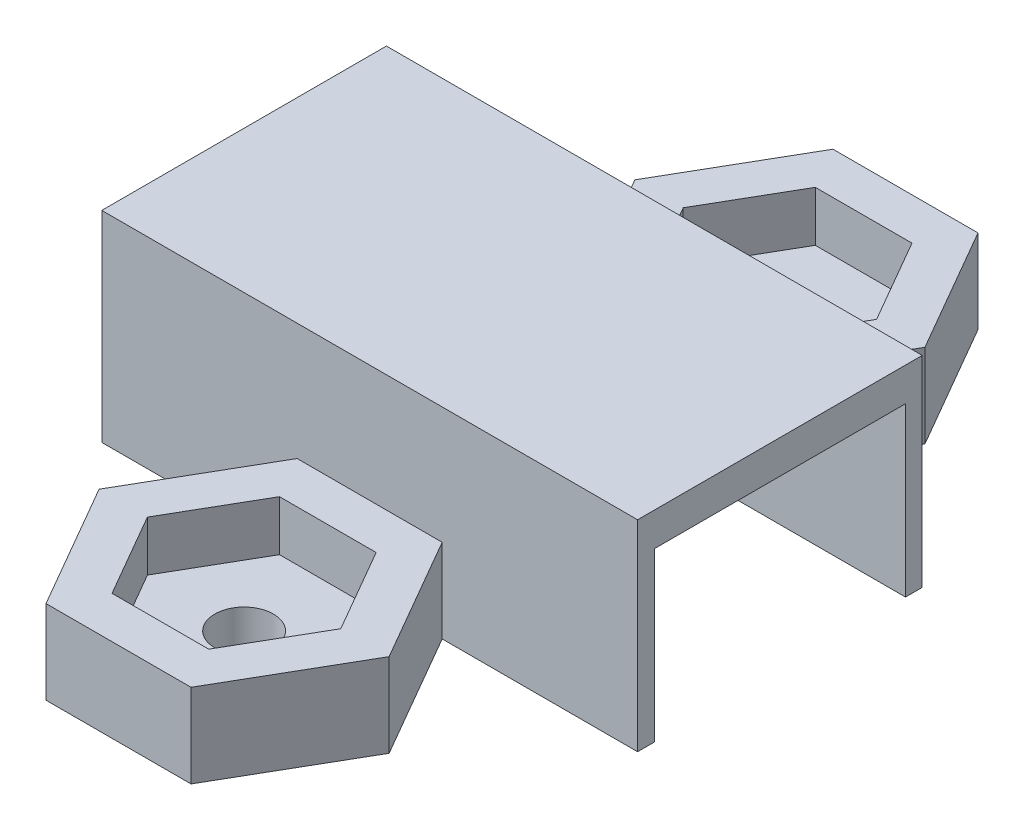
ISO-10303-21;
HEADER;
FILE_DESCRIPTION(('STEP AP214'),'2;1');
FILE_NAME('part.step','',(''),(''),'','','');
FILE_SCHEMA(('AUTOMOTIVE_DESIGN { 1 0 10303 214 1 1 1 1 }'));
ENDSEC;
DATA;
#1=APPLICATION_CONTEXT('core data for automotive mechanical design processes');
#2=APPLICATION_PROTOCOL_DEFINITION('international standard','automotive_design',2000,#1);
#3=PRODUCT_CONTEXT('',#1,'mechanical');
#4=PRODUCT('Part','Part','',(#3));
#5=PRODUCT_RELATED_PRODUCT_CATEGORY('part','',(#4));
#6=PRODUCT_DEFINITION_FORMATION('','',#4);
#7=PRODUCT_DEFINITION_CONTEXT('part definition',#1,'design');
#8=PRODUCT_DEFINITION('design','',#6,#7);
#9=PRODUCT_DEFINITION_SHAPE('','',#8);
#10=(LENGTH_UNIT() NAMED_UNIT(*) SI_UNIT(.MILLI.,.METRE.));
#11=(NAMED_UNIT(*) PLANE_ANGLE_UNIT() SI_UNIT($,.RADIAN.));
#12=(NAMED_UNIT(*) SI_UNIT($,.STERADIAN.) SOLID_ANGLE_UNIT());
#13=UNCERTAINTY_MEASURE_WITH_UNIT(LENGTH_MEASURE(1.E-05),#10,'distance_accuracy_value','');
#14=(GEOMETRIC_REPRESENTATION_CONTEXT(3) GLOBAL_UNCERTAINTY_ASSIGNED_CONTEXT((#13)) GLOBAL_UNIT_ASSIGNED_CONTEXT((#10,
#11,#12)) REPRESENTATION_CONTEXT('',''));
#15=CARTESIAN_POINT('',(0.,0.,0.));
#16=DIRECTION('',(0.,0.,1.));
#17=DIRECTION('',(1.,0.,0.));
#18=AXIS2_PLACEMENT_3D('',#15,#16,#17);
#19=CARTESIAN_POINT('',(-16.,12.,8.5));
#20=DIRECTION('',(0.,0.,-1.));
#21=DIRECTION('',(-1.,0.,0.));
#22=AXIS2_PLACEMENT_3D('',#19,#20,#21);
#23=PLANE('',#22);
#24=DIRECTION('',(0.,-1.,0.));
#25=VECTOR('',#24,1.);
#26=CARTESIAN_POINT('',(-4.3301270189222,5.,8.5));
#27=LINE('',#26,#25);
#28=CARTESIAN_POINT('',(-4.3301270189222,5.,8.5));
#29=VERTEX_POINT('',#28);
#30=CARTESIAN_POINT('',(-4.3301270189222,0.,8.5));
#31=VERTEX_POINT('',#30);
#32=EDGE_CURVE('E443',#29,#31,#27,.T.);
#33=ORIENTED_EDGE('',*,*,#32,.F.);
#34=DIRECTION('',(1.,0.,0.));
#35=VECTOR('',#34,1.);
#36=CARTESIAN_POINT('',(4.33012701892219,5.,8.5));
#37=LINE('',#36,#35);
#38=CARTESIAN_POINT('',(4.33012701892219,5.,8.5));
#39=VERTEX_POINT('',#38);
#40=EDGE_CURVE('E408',#29,#39,#37,.T.);
#41=ORIENTED_EDGE('',*,*,#40,.T.);
#42=DIRECTION('',(0.,-1.,0.));
#43=VECTOR('',#42,1.);
#44=CARTESIAN_POINT('',(4.33012701892219,5.,8.5));
#45=LINE('',#44,#43);
#46=CARTESIAN_POINT('',(4.33012701892219,0.,8.5));
#47=VERTEX_POINT('',#46);
#48=EDGE_CURVE('E439',#39,#47,#45,.T.);
#49=ORIENTED_EDGE('',*,*,#48,.T.);
#50=DIRECTION('',(1.,0.,0.));
#51=VECTOR('',#50,1.);
#52=CARTESIAN_POINT('',(-16.,0.,8.5));
#53=LINE('',#52,#51);
#54=CARTESIAN_POINT('',(16.,0.,8.5));
#55=VERTEX_POINT('',#54);
#56=EDGE_CURVE('E561',#47,#55,#53,.T.);
#57=ORIENTED_EDGE('',*,*,#56,.T.);
#58=DIRECTION('',(0.,-1.,0.));
#59=VECTOR('',#58,1.);
#60=CARTESIAN_POINT('',(16.,12.,8.5));
#61=LINE('',#60,#59);
#62=CARTESIAN_POINT('',(16.,12.,8.5));
#63=VERTEX_POINT('',#62);
#64=EDGE_CURVE('E582',#63,#55,#61,.T.);
#65=ORIENTED_EDGE('',*,*,#64,.F.);
#66=DIRECTION('',(1.,0.,0.));
#67=VECTOR('',#66,1.);
#68=CARTESIAN_POINT('',(-16.,12.,8.5));
#69=LINE('',#68,#67);
#70=CARTESIAN_POINT('',(-16.,12.,8.5));
#71=VERTEX_POINT('',#70);
#72=EDGE_CURVE('E546',#71,#63,#69,.T.);
#73=ORIENTED_EDGE('',*,*,#72,.F.);
#74=DIRECTION('',(0.,-1.,0.));
#75=VECTOR('',#74,1.);
#76=CARTESIAN_POINT('',(-16.,12.,8.5));
#77=LINE('',#76,#75);
#78=CARTESIAN_POINT('',(-16.,0.,8.5));
#79=VERTEX_POINT('',#78);
#80=EDGE_CURVE('E586',#71,#79,#77,.T.);
#81=ORIENTED_EDGE('',*,*,#80,.T.);
#82=EDGE_CURVE('E562',#79,#31,#53,.T.);
#83=ORIENTED_EDGE('',*,*,#82,.T.);
#84=EDGE_LOOP('',(#33,#41,#49,#57,#65,#73,#81,#83));
#85=FACE_BOUND('',#84,.T.);
#86=ADVANCED_FACE('F39',(#85),#23,.F.);
#87=CARTESIAN_POINT('',(-16.,12.,-8.5));
#88=DIRECTION('',(0.,0.,1.));
#89=DIRECTION('',(1.,0.,0.));
#90=AXIS2_PLACEMENT_3D('',#87,#88,#89);
#91=PLANE('',#90);
#92=DIRECTION('',(0.,-1.,0.));
#93=VECTOR('',#92,1.);
#94=CARTESIAN_POINT('',(4.33012701892219,5.,-8.5));
#95=LINE('',#94,#93);
#96=CARTESIAN_POINT('',(4.33012701892219,5.,-8.5));
#97=VERTEX_POINT('',#96);
#98=CARTESIAN_POINT('',(4.33012701892219,0.,-8.5));
#99=VERTEX_POINT('',#98);
#100=EDGE_CURVE('E479',#97,#99,#95,.T.);
#101=ORIENTED_EDGE('',*,*,#100,.F.);
#102=DIRECTION('',(-1.,0.,0.));
#103=VECTOR('',#102,1.);
#104=CARTESIAN_POINT('',(4.33012701892219,5.,-8.5));
#105=LINE('',#104,#103);
#106=CARTESIAN_POINT('',(-4.33012701892219,5.,-8.5));
#107=VERTEX_POINT('',#106);
#108=EDGE_CURVE('E458',#97,#107,#105,.T.);
#109=ORIENTED_EDGE('',*,*,#108,.T.);
#110=DIRECTION('',(0.,-1.,0.));
#111=VECTOR('',#110,1.);
#112=CARTESIAN_POINT('',(-4.33012701892219,5.,-8.5));
#113=LINE('',#112,#111);
#114=CARTESIAN_POINT('',(-4.33012701892219,0.,-8.5));
#115=VERTEX_POINT('',#114);
#116=EDGE_CURVE('E511',#107,#115,#113,.T.);
#117=ORIENTED_EDGE('',*,*,#116,.T.);
#118=DIRECTION('',(-1.,0.,0.));
#119=VECTOR('',#118,1.);
#120=CARTESIAN_POINT('',(-16.,0.,-8.5));
#121=LINE('',#120,#119);
#122=CARTESIAN_POINT('',(-16.,0.,-8.5));
#123=VERTEX_POINT('',#122);
#124=EDGE_CURVE('E571',#115,#123,#121,.T.);
#125=ORIENTED_EDGE('',*,*,#124,.T.);
#126=DIRECTION('',(0.,-1.,0.));
#127=VECTOR('',#126,1.);
#128=CARTESIAN_POINT('',(-16.,12.,-8.5));
#129=LINE('',#128,#127);
#130=CARTESIAN_POINT('',(-16.,12.,-8.5));
#131=VERTEX_POINT('',#130);
#132=EDGE_CURVE('E556',#131,#123,#129,.T.);
#133=ORIENTED_EDGE('',*,*,#132,.F.);
#134=DIRECTION('',(-1.,0.,0.));
#135=VECTOR('',#134,1.);
#136=CARTESIAN_POINT('',(-16.,12.,-8.5));
#137=LINE('',#136,#135);
#138=CARTESIAN_POINT('',(16.,12.,-8.5));
#139=VERTEX_POINT('',#138);
#140=EDGE_CURVE('E553',#139,#131,#137,.T.);
#141=ORIENTED_EDGE('',*,*,#140,.F.);
#142=DIRECTION('',(0.,-1.,0.));
#143=VECTOR('',#142,1.);
#144=CARTESIAN_POINT('',(16.,12.,-8.5));
#145=LINE('',#144,#143);
#146=CARTESIAN_POINT('',(16.,0.,-8.5));
#147=VERTEX_POINT('',#146);
#148=EDGE_CURVE('E578',#139,#147,#145,.T.);
#149=ORIENTED_EDGE('',*,*,#148,.T.);
#150=EDGE_CURVE('E547',#147,#99,#121,.T.);
#151=ORIENTED_EDGE('',*,*,#150,.T.);
#152=EDGE_LOOP('',(#101,#109,#117,#125,#133,#141,#149,#151));
#153=FACE_BOUND('',#152,.T.);
#154=ADVANCED_FACE('F698',(#153),#91,.F.);
#155=CARTESIAN_POINT('',(0.,0.,0.));
#156=DIRECTION('',(0.,1.,0.));
#157=DIRECTION('',(0.,0.,1.));
#158=AXIS2_PLACEMENT_3D('',#155,#156,#157);
#159=PLANE('',#158);
#160=CARTESIAN_POINT('',(0.,0.,-16.));
#161=DIRECTION('',(0.,1.,0.));
#162=DIRECTION('',(0.,0.,1.));
#163=AXIS2_PLACEMENT_3D('',#160,#161,#162);
#164=CIRCLE('',#163,1.75);
#165=CARTESIAN_POINT('',(0.,0.,-14.25));
#166=VERTEX_POINT('',#165);
#167=EDGE_CURVE('E43',#166,#166,#164,.T.);
#168=ORIENTED_EDGE('',*,*,#167,.T.);
#169=EDGE_LOOP('',(#168));
#170=FACE_BOUND('',#169,.T.);
#171=DIRECTION('',(0.,0.,-1.));
#172=VECTOR('',#171,1.);
#173=CARTESIAN_POINT('',(16.,0.,-8.5));
#174=LINE('',#173,#172);
#175=CARTESIAN_POINT('',(16.,0.,-7.5));
#176=VERTEX_POINT('',#175);
#177=EDGE_CURVE('E566',#176,#147,#174,.T.);
#178=ORIENTED_EDGE('',*,*,#177,.F.);
#179=DIRECTION('',(-1.,0.,0.));
#180=VECTOR('',#179,1.);
#181=CARTESIAN_POINT('',(0.,0.,-7.5));
#182=LINE('',#181,#180);
#183=CARTESIAN_POINT('',(-16.,0.,-7.5));
#184=VERTEX_POINT('',#183);
#185=EDGE_CURVE('E49',#176,#184,#182,.T.);
#186=ORIENTED_EDGE('',*,*,#185,.T.);
#187=DIRECTION('',(0.,0.,1.));
#188=VECTOR('',#187,1.);
#189=CARTESIAN_POINT('',(-16.,0.,-8.5));
#190=LINE('',#189,#188);
#191=EDGE_CURVE('E557',#123,#184,#190,.T.);
#192=ORIENTED_EDGE('',*,*,#191,.F.);
#193=ORIENTED_EDGE('',*,*,#124,.F.);
#194=DIRECTION('',(-0.5,0.,-0.866025403784439));
#195=VECTOR('',#194,1.);
#196=CARTESIAN_POINT('',(-4.33012701892219,0.,-8.5));
#197=LINE('',#196,#195);
#198=CARTESIAN_POINT('',(-8.66025403784439,0.,-16.));
#199=VERTEX_POINT('',#198);
#200=EDGE_CURVE('E483',#115,#199,#197,.T.);
#201=ORIENTED_EDGE('',*,*,#200,.T.);
#202=DIRECTION('',(0.5,0.,-0.866025403784438));
#203=VECTOR('',#202,1.);
#204=CARTESIAN_POINT('',(-8.66025403784439,0.,-16.));
#205=LINE('',#204,#203);
#206=CARTESIAN_POINT('',(-4.33012701892219,0.,-23.5));
#207=VERTEX_POINT('',#206);
#208=EDGE_CURVE('E487',#199,#207,#205,.T.);
#209=ORIENTED_EDGE('',*,*,#208,.T.);
#210=DIRECTION('',(1.,0.,0.));
#211=VECTOR('',#210,1.);
#212=CARTESIAN_POINT('',(-4.33012701892219,0.,-23.5));
#213=LINE('',#212,#211);
#214=CARTESIAN_POINT('',(4.3301270189222,0.,-23.5));
#215=VERTEX_POINT('',#214);
#216=EDGE_CURVE('E491',#207,#215,#213,.T.);
#217=ORIENTED_EDGE('',*,*,#216,.T.);
#218=DIRECTION('',(0.5,0.,0.866025403784439));
#219=VECTOR('',#218,1.);
#220=CARTESIAN_POINT('',(4.3301270189222,0.,-23.5));
#221=LINE('',#220,#219);
#222=CARTESIAN_POINT('',(8.66025403784439,0.,-16.));
#223=VERTEX_POINT('',#222);
#224=EDGE_CURVE('E459',#215,#223,#221,.T.);
#225=ORIENTED_EDGE('',*,*,#224,.T.);
#226=DIRECTION('',(-0.5,0.,0.866025403784439));
#227=VECTOR('',#226,1.);
#228=CARTESIAN_POINT('',(8.66025403784439,0.,-16.));
#229=LINE('',#228,#227);
#230=EDGE_CURVE('E438',#223,#99,#229,.T.);
#231=ORIENTED_EDGE('',*,*,#230,.T.);
#232=ORIENTED_EDGE('',*,*,#150,.F.);
#233=EDGE_LOOP('',(#178,#186,#192,#193,#201,#209,#217,#225,#231,#232));
#234=FACE_BOUND('',#233,.T.);
#235=ADVANCED_FACE('F684',(#170,#234),#159,.F.);
#236=CARTESIAN_POINT('',(-16.,12.,-8.5));
#237=DIRECTION('',(1.,0.,0.));
#238=DIRECTION('',(0.,0.,-1.));
#239=AXIS2_PLACEMENT_3D('',#236,#237,#238);
#240=PLANE('',#239);
#241=ORIENTED_EDGE('',*,*,#191,.T.);
#242=DIRECTION('',(0.,-1.,0.));
#243=VECTOR('',#242,1.);
#244=CARTESIAN_POINT('',(-16.,10.,-7.5));
#245=LINE('',#244,#243);
#246=CARTESIAN_POINT('',(-16.,10.,-7.5));
#247=VERTEX_POINT('',#246);
#248=EDGE_CURVE('E501',#247,#184,#245,.T.);
#249=ORIENTED_EDGE('',*,*,#248,.F.);
#250=DIRECTION('',(0.,0.,-1.));
#251=VECTOR('',#250,1.);
#252=CARTESIAN_POINT('',(-16.,10.,-7.5));
#253=LINE('',#252,#251);
#254=CARTESIAN_POINT('',(-16.,10.,7.5));
#255=VERTEX_POINT('',#254);
#256=EDGE_CURVE('E523',#255,#247,#253,.T.);
#257=ORIENTED_EDGE('',*,*,#256,.F.);
#258=DIRECTION('',(0.,1.,0.));
#259=VECTOR('',#258,1.);
#260=CARTESIAN_POINT('',(-16.,10.,7.5));
#261=LINE('',#260,#259);
#262=CARTESIAN_POINT('',(-16.,0.,7.5));
#263=VERTEX_POINT('',#262);
#264=EDGE_CURVE('E519',#263,#255,#261,.T.);
#265=ORIENTED_EDGE('',*,*,#264,.F.);
#266=EDGE_CURVE('E541',#263,#79,#190,.T.);
#267=ORIENTED_EDGE('',*,*,#266,.T.);
#268=ORIENTED_EDGE('',*,*,#80,.F.);
#269=DIRECTION('',(0.,0.,1.));
#270=VECTOR('',#269,1.);
#271=CARTESIAN_POINT('',(-16.,12.,-8.5));
#272=LINE('',#271,#270);
#273=EDGE_CURVE('E542',#131,#71,#272,.T.);
#274=ORIENTED_EDGE('',*,*,#273,.F.);
#275=ORIENTED_EDGE('',*,*,#132,.T.);
#276=EDGE_LOOP('',(#241,#249,#257,#265,#267,#268,#274,#275));
#277=FACE_BOUND('',#276,.T.);
#278=ADVANCED_FACE('F41',(#277),#240,.F.);
#279=CARTESIAN_POINT('',(16.,12.,-8.5));
#280=DIRECTION('',(-1.,0.,0.));
#281=DIRECTION('',(0.,0.,1.));
#282=AXIS2_PLACEMENT_3D('',#279,#280,#281);
#283=PLANE('',#282);
#284=DIRECTION('',(0.,0.,-1.));
#285=VECTOR('',#284,1.);
#286=CARTESIAN_POINT('',(16.,10.,-8.5));
#287=LINE('',#286,#285);
#288=CARTESIAN_POINT('',(16.,10.,7.5));
#289=VERTEX_POINT('',#288);
#290=CARTESIAN_POINT('',(16.,10.,-7.5));
#291=VERTEX_POINT('',#290);
#292=EDGE_CURVE('E11',#289,#291,#287,.T.);
#293=ORIENTED_EDGE('',*,*,#292,.T.);
#294=DIRECTION('',(0.,-1.,0.));
#295=VECTOR('',#294,1.);
#296=CARTESIAN_POINT('',(16.,12.,-7.5));
#297=LINE('',#296,#295);
#298=EDGE_CURVE('E537',#291,#176,#297,.T.);
#299=ORIENTED_EDGE('',*,*,#298,.T.);
#300=ORIENTED_EDGE('',*,*,#177,.T.);
#301=ORIENTED_EDGE('',*,*,#148,.F.);
#302=DIRECTION('',(0.,0.,-1.));
#303=VECTOR('',#302,1.);
#304=CARTESIAN_POINT('',(16.,12.,-8.5));
#305=LINE('',#304,#303);
#306=EDGE_CURVE('E550',#63,#139,#305,.T.);
#307=ORIENTED_EDGE('',*,*,#306,.F.);
#308=ORIENTED_EDGE('',*,*,#64,.T.);
#309=CARTESIAN_POINT('',(16.,0.,7.5));
#310=VERTEX_POINT('',#309);
#311=EDGE_CURVE('E567',#55,#310,#174,.T.);
#312=ORIENTED_EDGE('',*,*,#311,.T.);
#313=DIRECTION('',(0.,1.,0.));
#314=VECTOR('',#313,1.);
#315=CARTESIAN_POINT('',(16.,12.,7.5));
#316=LINE('',#315,#314);
#317=EDGE_CURVE('E531',#310,#289,#316,.T.);
#318=ORIENTED_EDGE('',*,*,#317,.T.);
#319=EDGE_LOOP('',(#293,#299,#300,#301,#307,#308,#312,#318));
#320=FACE_BOUND('',#319,.T.);
#321=ADVANCED_FACE('F690',(#320),#283,.F.);
#322=CARTESIAN_POINT('',(0.,12.,0.));
#323=DIRECTION('',(0.,1.,0.));
#324=DIRECTION('',(0.,0.,1.));
#325=AXIS2_PLACEMENT_3D('',#322,#323,#324);
#326=PLANE('',#325);
#327=ORIENTED_EDGE('',*,*,#273,.T.);
#328=ORIENTED_EDGE('',*,*,#72,.T.);
#329=ORIENTED_EDGE('',*,*,#306,.T.);
#330=ORIENTED_EDGE('',*,*,#140,.T.);
#331=EDGE_LOOP('',(#327,#328,#329,#330));
#332=FACE_BOUND('',#331,.T.);
#333=ADVANCED_FACE('F675',(#332),#326,.T.);
#334=CARTESIAN_POINT('',(0.,0.,16.));
#335=DIRECTION('',(0.,1.,0.));
#336=DIRECTION('',(0.,0.,1.));
#337=AXIS2_PLACEMENT_3D('',#334,#335,#336);
#338=CIRCLE('',#337,1.75);
#339=CARTESIAN_POINT('',(0.,0.,17.75));
#340=VERTEX_POINT('',#339);
#341=EDGE_CURVE('E596',#340,#340,#338,.T.);
#342=ORIENTED_EDGE('',*,*,#341,.T.);
#343=EDGE_LOOP('',(#342));
#344=FACE_BOUND('',#343,.T.);
#345=ORIENTED_EDGE('',*,*,#266,.F.);
#346=DIRECTION('',(1.,0.,0.));
#347=VECTOR('',#346,1.);
#348=CARTESIAN_POINT('',(0.,0.,7.5));
#349=LINE('',#348,#347);
#350=EDGE_CURVE('E590',#263,#310,#349,.T.);
#351=ORIENTED_EDGE('',*,*,#350,.T.);
#352=ORIENTED_EDGE('',*,*,#311,.F.);
#353=ORIENTED_EDGE('',*,*,#56,.F.);
#354=DIRECTION('',(0.5,0.,0.866025403784439));
#355=VECTOR('',#354,1.);
#356=CARTESIAN_POINT('',(8.66025403784439,0.,16.));
#357=LINE('',#356,#355);
#358=CARTESIAN_POINT('',(8.66025403784439,0.,16.));
#359=VERTEX_POINT('',#358);
#360=EDGE_CURVE('E396',#47,#359,#357,.T.);
#361=ORIENTED_EDGE('',*,*,#360,.T.);
#362=DIRECTION('',(-0.5,0.,0.866025403784439));
#363=VECTOR('',#362,1.);
#364=CARTESIAN_POINT('',(4.3301270189222,0.,23.5));
#365=LINE('',#364,#363);
#366=CARTESIAN_POINT('',(4.3301270189222,0.,23.5));
#367=VERTEX_POINT('',#366);
#368=EDGE_CURVE('E316',#359,#367,#365,.T.);
#369=ORIENTED_EDGE('',*,*,#368,.T.);
#370=DIRECTION('',(-1.,0.,0.));
#371=VECTOR('',#370,1.);
#372=CARTESIAN_POINT('',(-4.33012701892219,0.,23.5));
#373=LINE('',#372,#371);
#374=CARTESIAN_POINT('',(-4.33012701892219,0.,23.5));
#375=VERTEX_POINT('',#374);
#376=EDGE_CURVE('E420',#367,#375,#373,.T.);
#377=ORIENTED_EDGE('',*,*,#376,.T.);
#378=DIRECTION('',(-0.5,0.,-0.866025403784438));
#379=VECTOR('',#378,1.);
#380=CARTESIAN_POINT('',(-8.66025403784439,0.,16.));
#381=LINE('',#380,#379);
#382=CARTESIAN_POINT('',(-8.66025403784439,0.,16.));
#383=VERTEX_POINT('',#382);
#384=EDGE_CURVE('E424',#375,#383,#381,.T.);
#385=ORIENTED_EDGE('',*,*,#384,.T.);
#386=DIRECTION('',(0.499999999999999,0.,-0.866025403784439));
#387=VECTOR('',#386,1.);
#388=CARTESIAN_POINT('',(-4.3301270189222,0.,8.5));
#389=LINE('',#388,#387);
#390=EDGE_CURVE('E428',#383,#31,#389,.T.);
#391=ORIENTED_EDGE('',*,*,#390,.T.);
#392=ORIENTED_EDGE('',*,*,#82,.F.);
#393=EDGE_LOOP('',(#345,#351,#352,#353,#361,#369,#377,#385,#391,#392));
#394=FACE_BOUND('',#393,.T.);
#395=ADVANCED_FACE('F662',(#344,#394),#159,.F.);
#396=CARTESIAN_POINT('',(42.,10.,-7.5));
#397=DIRECTION('',(0.,1.,0.));
#398=DIRECTION('',(0.,0.,1.));
#399=AXIS2_PLACEMENT_3D('',#396,#397,#398);
#400=PLANE('',#399);
#401=DIRECTION('',(-1.,0.,0.));
#402=VECTOR('',#401,1.);
#403=CARTESIAN_POINT('',(42.,10.,7.5));
#404=LINE('',#403,#402);
#405=EDGE_CURVE('E527',#289,#255,#404,.T.);
#406=ORIENTED_EDGE('',*,*,#405,.T.);
#407=ORIENTED_EDGE('',*,*,#256,.T.);
#408=DIRECTION('',(-1.,0.,0.));
#409=VECTOR('',#408,1.);
#410=CARTESIAN_POINT('',(42.,10.,-7.5));
#411=LINE('',#410,#409);
#412=EDGE_CURVE('E528',#291,#247,#411,.T.);
#413=ORIENTED_EDGE('',*,*,#412,.F.);
#414=ORIENTED_EDGE('',*,*,#292,.F.);
#415=EDGE_LOOP('',(#406,#407,#413,#414));
#416=FACE_BOUND('',#415,.T.);
#417=ADVANCED_FACE('F694',(#416),#400,.F.);
#418=CARTESIAN_POINT('',(42.,10.,-7.5));
#419=DIRECTION('',(0.,0.,-1.));
#420=DIRECTION('',(-1.,0.,0.));
#421=AXIS2_PLACEMENT_3D('',#418,#419,#420);
#422=PLANE('',#421);
#423=ORIENTED_EDGE('',*,*,#412,.T.);
#424=ORIENTED_EDGE('',*,*,#248,.T.);
#425=ORIENTED_EDGE('',*,*,#185,.F.);
#426=ORIENTED_EDGE('',*,*,#298,.F.);
#427=EDGE_LOOP('',(#423,#424,#425,#426));
#428=FACE_BOUND('',#427,.T.);
#429=ADVANCED_FACE('F687',(#428),#422,.F.);
#430=CARTESIAN_POINT('',(42.,10.,7.5));
#431=DIRECTION('',(0.,0.,1.));
#432=DIRECTION('',(1.,0.,0.));
#433=AXIS2_PLACEMENT_3D('',#430,#431,#432);
#434=PLANE('',#433);
#435=ORIENTED_EDGE('',*,*,#350,.F.);
#436=ORIENTED_EDGE('',*,*,#264,.T.);
#437=ORIENTED_EDGE('',*,*,#405,.F.);
#438=ORIENTED_EDGE('',*,*,#317,.F.);
#439=EDGE_LOOP('',(#435,#436,#437,#438));
#440=FACE_BOUND('',#439,.T.);
#441=ADVANCED_FACE('F696',(#440),#434,.F.);
#442=CARTESIAN_POINT('',(8.66025403784439,5.,-16.));
#443=DIRECTION('',(0.866025403784439,0.,0.5));
#444=DIRECTION('',(0.5,0.,-0.866025403784439));
#445=AXIS2_PLACEMENT_3D('',#442,#443,#444);
#446=PLANE('',#445);
#447=ORIENTED_EDGE('',*,*,#230,.F.);
#448=DIRECTION('',(0.,-1.,0.));
#449=VECTOR('',#448,1.);
#450=CARTESIAN_POINT('',(8.66025403784439,5.,-16.));
#451=LINE('',#450,#449);
#452=CARTESIAN_POINT('',(8.66025403784439,5.,-16.));
#453=VERTEX_POINT('',#452);
#454=EDGE_CURVE('E498',#453,#223,#451,.T.);
#455=ORIENTED_EDGE('',*,*,#454,.F.);
#456=DIRECTION('',(-0.5,0.,0.866025403784439));
#457=VECTOR('',#456,1.);
#458=CARTESIAN_POINT('',(8.66025403784439,5.,-16.));
#459=LINE('',#458,#457);
#460=EDGE_CURVE('E454',#453,#97,#459,.T.);
#461=ORIENTED_EDGE('',*,*,#460,.T.);
#462=ORIENTED_EDGE('',*,*,#100,.T.);
#463=EDGE_LOOP('',(#447,#455,#461,#462));
#464=FACE_BOUND('',#463,.T.);
#465=ADVANCED_FACE('F834',(#464),#446,.T.);
#466=CARTESIAN_POINT('',(4.3301270189222,5.,-23.5));
#467=DIRECTION('',(0.866025403784439,0.,-0.5));
#468=DIRECTION('',(-0.5,0.,-0.866025403784439));
#469=AXIS2_PLACEMENT_3D('',#466,#467,#468);
#470=PLANE('',#469);
#471=ORIENTED_EDGE('',*,*,#224,.F.);
#472=DIRECTION('',(0.,-1.,0.));
#473=VECTOR('',#472,1.);
#474=CARTESIAN_POINT('',(4.3301270189222,5.,-23.5));
#475=LINE('',#474,#473);
#476=CARTESIAN_POINT('',(4.3301270189222,5.,-23.5));
#477=VERTEX_POINT('',#476);
#478=EDGE_CURVE('E502',#477,#215,#475,.T.);
#479=ORIENTED_EDGE('',*,*,#478,.F.);
#480=DIRECTION('',(0.5,0.,0.866025403784439));
#481=VECTOR('',#480,1.);
#482=CARTESIAN_POINT('',(4.3301270189222,5.,-23.5));
#483=LINE('',#482,#481);
#484=EDGE_CURVE('E475',#477,#453,#483,.T.);
#485=ORIENTED_EDGE('',*,*,#484,.T.);
#486=ORIENTED_EDGE('',*,*,#454,.T.);
#487=EDGE_LOOP('',(#471,#479,#485,#486));
#488=FACE_BOUND('',#487,.T.);
#489=ADVANCED_FACE('F830',(#488),#470,.T.);
#490=CARTESIAN_POINT('',(-4.33012701892219,5.,-23.5));
#491=DIRECTION('',(0.,0.,-1.));
#492=DIRECTION('',(-1.,0.,0.));
#493=AXIS2_PLACEMENT_3D('',#490,#491,#492);
#494=PLANE('',#493);
#495=ORIENTED_EDGE('',*,*,#216,.F.);
#496=DIRECTION('',(0.,-1.,0.));
#497=VECTOR('',#496,1.);
#498=CARTESIAN_POINT('',(-4.33012701892219,5.,-23.5));
#499=LINE('',#498,#497);
#500=CARTESIAN_POINT('',(-4.33012701892219,5.,-23.5));
#501=VERTEX_POINT('',#500);
#502=EDGE_CURVE('E505',#501,#207,#499,.T.);
#503=ORIENTED_EDGE('',*,*,#502,.F.);
#504=DIRECTION('',(1.,0.,0.));
#505=VECTOR('',#504,1.);
#506=CARTESIAN_POINT('',(-4.33012701892219,5.,-23.5));
#507=LINE('',#506,#505);
#508=EDGE_CURVE('E471',#501,#477,#507,.T.);
#509=ORIENTED_EDGE('',*,*,#508,.T.);
#510=ORIENTED_EDGE('',*,*,#478,.T.);
#511=EDGE_LOOP('',(#495,#503,#509,#510));
#512=FACE_BOUND('',#511,.T.);
#513=ADVANCED_FACE('F833',(#512),#494,.T.);
#514=CARTESIAN_POINT('',(-8.66025403784439,5.,-16.));
#515=DIRECTION('',(-0.866025403784438,0.,-0.5));
#516=DIRECTION('',(-0.5,0.,0.866025403784438));
#517=AXIS2_PLACEMENT_3D('',#514,#515,#516);
#518=PLANE('',#517);
#519=ORIENTED_EDGE('',*,*,#208,.F.);
#520=DIRECTION('',(0.,-1.,0.));
#521=VECTOR('',#520,1.);
#522=CARTESIAN_POINT('',(-8.66025403784439,5.,-16.));
#523=LINE('',#522,#521);
#524=CARTESIAN_POINT('',(-8.66025403784439,5.,-16.));
#525=VERTEX_POINT('',#524);
#526=EDGE_CURVE('E508',#525,#199,#523,.T.);
#527=ORIENTED_EDGE('',*,*,#526,.F.);
#528=DIRECTION('',(0.5,0.,-0.866025403784438));
#529=VECTOR('',#528,1.);
#530=CARTESIAN_POINT('',(-8.66025403784439,5.,-16.));
#531=LINE('',#530,#529);
#532=EDGE_CURVE('E467',#525,#501,#531,.T.);
#533=ORIENTED_EDGE('',*,*,#532,.T.);
#534=ORIENTED_EDGE('',*,*,#502,.T.);
#535=EDGE_LOOP('',(#519,#527,#533,#534));
#536=FACE_BOUND('',#535,.T.);
#537=ADVANCED_FACE('F838',(#536),#518,.T.);
#538=CARTESIAN_POINT('',(-4.33012701892219,5.,-8.5));
#539=DIRECTION('',(-0.866025403784439,0.,0.5));
#540=DIRECTION('',(0.5,0.,0.866025403784439));
#541=AXIS2_PLACEMENT_3D('',#538,#539,#540);
#542=PLANE('',#541);
#543=ORIENTED_EDGE('',*,*,#200,.F.);
#544=ORIENTED_EDGE('',*,*,#116,.F.);
#545=DIRECTION('',(-0.5,0.,-0.866025403784439));
#546=VECTOR('',#545,1.);
#547=CARTESIAN_POINT('',(-4.33012701892219,5.,-8.5));
#548=LINE('',#547,#546);
#549=EDGE_CURVE('E463',#107,#525,#548,.T.);
#550=ORIENTED_EDGE('',*,*,#549,.T.);
#551=ORIENTED_EDGE('',*,*,#526,.T.);
#552=EDGE_LOOP('',(#543,#544,#550,#551));
#553=FACE_BOUND('',#552,.T.);
#554=ADVANCED_FACE('F828',(#553),#542,.T.);
#555=CARTESIAN_POINT('',(0.,5.,0.));
#556=DIRECTION('',(0.,-1.,0.));
#557=DIRECTION('',(0.,0.,-1.));
#558=AXIS2_PLACEMENT_3D('',#555,#556,#557);
#559=PLANE('',#558);
#560=DIRECTION('',(0.5,0.,-0.866025403784439));
#561=VECTOR('',#560,1.);
#562=CARTESIAN_POINT('',(2.88675134594813,5.,-11.));
#563=LINE('',#562,#561);
#564=CARTESIAN_POINT('',(2.88675134594813,5.,-11.));
#565=VERTEX_POINT('',#564);
#566=CARTESIAN_POINT('',(5.77350269189626,5.,-16.));
#567=VERTEX_POINT('',#566);
#568=EDGE_CURVE('E298',#565,#567,#563,.T.);
#569=ORIENTED_EDGE('',*,*,#568,.F.);
#570=DIRECTION('',(1.,0.,0.));
#571=VECTOR('',#570,1.);
#572=CARTESIAN_POINT('',(-2.88675134594813,5.,-11.));
#573=LINE('',#572,#571);
#574=CARTESIAN_POINT('',(-2.88675134594813,5.,-11.));
#575=VERTEX_POINT('',#574);
#576=EDGE_CURVE('E57',#575,#565,#573,.T.);
#577=ORIENTED_EDGE('',*,*,#576,.F.);
#578=DIRECTION('',(0.5,0.,0.866025403784439));
#579=VECTOR('',#578,1.);
#580=CARTESIAN_POINT('',(-5.77350269189626,5.,-16.));
#581=LINE('',#580,#579);
#582=CARTESIAN_POINT('',(-5.77350269189626,5.,-16.));
#583=VERTEX_POINT('',#582);
#584=EDGE_CURVE('E275',#583,#575,#581,.T.);
#585=ORIENTED_EDGE('',*,*,#584,.F.);
#586=DIRECTION('',(-0.5,0.,0.866025403784439));
#587=VECTOR('',#586,1.);
#588=CARTESIAN_POINT('',(-2.88675134594813,5.,-21.));
#589=LINE('',#588,#587);
#590=CARTESIAN_POINT('',(-2.88675134594813,5.,-21.));
#591=VERTEX_POINT('',#590);
#592=EDGE_CURVE('E279',#591,#583,#589,.T.);
#593=ORIENTED_EDGE('',*,*,#592,.F.);
#594=DIRECTION('',(-1.,0.,0.));
#595=VECTOR('',#594,1.);
#596=CARTESIAN_POINT('',(2.88675134594814,5.,-21.));
#597=LINE('',#596,#595);
#598=CARTESIAN_POINT('',(2.88675134594814,5.,-21.));
#599=VERTEX_POINT('',#598);
#600=EDGE_CURVE('E306',#599,#591,#597,.T.);
#601=ORIENTED_EDGE('',*,*,#600,.F.);
#602=DIRECTION('',(-0.5,0.,-0.866025403784439));
#603=VECTOR('',#602,1.);
#604=CARTESIAN_POINT('',(5.77350269189626,5.,-16.));
#605=LINE('',#604,#603);
#606=EDGE_CURVE('E302',#567,#599,#605,.T.);
#607=ORIENTED_EDGE('',*,*,#606,.F.);
#608=EDGE_LOOP('',(#569,#577,#585,#593,#601,#607));
#609=FACE_BOUND('',#608,.T.);
#610=ORIENTED_EDGE('',*,*,#460,.F.);
#611=ORIENTED_EDGE('',*,*,#484,.F.);
#612=ORIENTED_EDGE('',*,*,#508,.F.);
#613=ORIENTED_EDGE('',*,*,#532,.F.);
#614=ORIENTED_EDGE('',*,*,#549,.F.);
#615=ORIENTED_EDGE('',*,*,#108,.F.);
#616=EDGE_LOOP('',(#610,#611,#612,#613,#614,#615));
#617=FACE_BOUND('',#616,.T.);
#618=ADVANCED_FACE('F825',(#609,#617),#559,.F.);
#619=CARTESIAN_POINT('',(4.3301270189222,5.,23.5));
#620=DIRECTION('',(0.866025403784439,0.,0.5));
#621=DIRECTION('',(0.5,0.,-0.866025403784439));
#622=AXIS2_PLACEMENT_3D('',#619,#620,#621);
#623=PLANE('',#622);
#624=ORIENTED_EDGE('',*,*,#368,.F.);
#625=DIRECTION('',(0.,-1.,0.));
#626=VECTOR('',#625,1.);
#627=CARTESIAN_POINT('',(8.66025403784439,5.,16.));
#628=LINE('',#627,#626);
#629=CARTESIAN_POINT('',(8.66025403784439,5.,16.));
#630=VERTEX_POINT('',#629);
#631=EDGE_CURVE('E435',#630,#359,#628,.T.);
#632=ORIENTED_EDGE('',*,*,#631,.F.);
#633=DIRECTION('',(-0.5,0.,0.866025403784439));
#634=VECTOR('',#633,1.);
#635=CARTESIAN_POINT('',(4.3301270189222,5.,23.5));
#636=LINE('',#635,#634);
#637=CARTESIAN_POINT('',(4.3301270189222,5.,23.5));
#638=VERTEX_POINT('',#637);
#639=EDGE_CURVE('E391',#630,#638,#636,.T.);
#640=ORIENTED_EDGE('',*,*,#639,.T.);
#641=DIRECTION('',(0.,-1.,0.));
#642=VECTOR('',#641,1.);
#643=CARTESIAN_POINT('',(4.3301270189222,5.,23.5));
#644=LINE('',#643,#642);
#645=EDGE_CURVE('E416',#638,#367,#644,.T.);
#646=ORIENTED_EDGE('',*,*,#645,.T.);
#647=EDGE_LOOP('',(#624,#632,#640,#646));
#648=FACE_BOUND('',#647,.T.);
#649=ADVANCED_FACE('F812',(#648),#623,.T.);
#650=CARTESIAN_POINT('',(8.66025403784439,5.,16.));
#651=DIRECTION('',(0.866025403784439,0.,-0.5));
#652=DIRECTION('',(-0.5,0.,-0.866025403784439));
#653=AXIS2_PLACEMENT_3D('',#650,#651,#652);
#654=PLANE('',#653);
#655=ORIENTED_EDGE('',*,*,#360,.F.);
#656=ORIENTED_EDGE('',*,*,#48,.F.);
#657=DIRECTION('',(0.5,0.,0.866025403784439));
#658=VECTOR('',#657,1.);
#659=CARTESIAN_POINT('',(8.66025403784439,5.,16.));
#660=LINE('',#659,#658);
#661=EDGE_CURVE('E412',#39,#630,#660,.T.);
#662=ORIENTED_EDGE('',*,*,#661,.T.);
#663=ORIENTED_EDGE('',*,*,#631,.T.);
#664=EDGE_LOOP('',(#655,#656,#662,#663));
#665=FACE_BOUND('',#664,.T.);
#666=ADVANCED_FACE('F653',(#665),#654,.T.);
#667=CARTESIAN_POINT('',(-4.3301270189222,5.,8.5));
#668=DIRECTION('',(-0.866025403784439,0.,-0.499999999999999));
#669=DIRECTION('',(-0.499999999999999,0.,0.866025403784439));
#670=AXIS2_PLACEMENT_3D('',#667,#668,#669);
#671=PLANE('',#670);
#672=ORIENTED_EDGE('',*,*,#390,.F.);
#673=DIRECTION('',(0.,-1.,0.));
#674=VECTOR('',#673,1.);
#675=CARTESIAN_POINT('',(-8.66025403784439,5.,16.));
#676=LINE('',#675,#674);
#677=CARTESIAN_POINT('',(-8.66025403784439,5.,16.));
#678=VERTEX_POINT('',#677);
#679=EDGE_CURVE('E446',#678,#383,#676,.T.);
#680=ORIENTED_EDGE('',*,*,#679,.F.);
#681=DIRECTION('',(0.499999999999999,0.,-0.866025403784439));
#682=VECTOR('',#681,1.);
#683=CARTESIAN_POINT('',(-4.3301270189222,5.,8.5));
#684=LINE('',#683,#682);
#685=EDGE_CURVE('E404',#678,#29,#684,.T.);
#686=ORIENTED_EDGE('',*,*,#685,.T.);
#687=ORIENTED_EDGE('',*,*,#32,.T.);
#688=EDGE_LOOP('',(#672,#680,#686,#687));
#689=FACE_BOUND('',#688,.T.);
#690=ADVANCED_FACE('F811',(#689),#671,.T.);
#691=CARTESIAN_POINT('',(-8.66025403784439,5.,16.));
#692=DIRECTION('',(-0.866025403784438,0.,0.5));
#693=DIRECTION('',(0.5,0.,0.866025403784438));
#694=AXIS2_PLACEMENT_3D('',#691,#692,#693);
#695=PLANE('',#694);
#696=ORIENTED_EDGE('',*,*,#384,.F.);
#697=DIRECTION('',(0.,-1.,0.));
#698=VECTOR('',#697,1.);
#699=CARTESIAN_POINT('',(-4.33012701892219,5.,23.5));
#700=LINE('',#699,#698);
#701=CARTESIAN_POINT('',(-4.33012701892219,5.,23.5));
#702=VERTEX_POINT('',#701);
#703=EDGE_CURVE('E449',#702,#375,#700,.T.);
#704=ORIENTED_EDGE('',*,*,#703,.F.);
#705=DIRECTION('',(-0.5,0.,-0.866025403784438));
#706=VECTOR('',#705,1.);
#707=CARTESIAN_POINT('',(-8.66025403784439,5.,16.));
#708=LINE('',#707,#706);
#709=EDGE_CURVE('E400',#702,#678,#708,.T.);
#710=ORIENTED_EDGE('',*,*,#709,.T.);
#711=ORIENTED_EDGE('',*,*,#679,.T.);
#712=EDGE_LOOP('',(#696,#704,#710,#711));
#713=FACE_BOUND('',#712,.T.);
#714=ADVANCED_FACE('F815',(#713),#695,.T.);
#715=CARTESIAN_POINT('',(-4.33012701892219,5.,23.5));
#716=DIRECTION('',(0.,0.,1.));
#717=DIRECTION('',(1.,0.,0.));
#718=AXIS2_PLACEMENT_3D('',#715,#716,#717);
#719=PLANE('',#718);
#720=ORIENTED_EDGE('',*,*,#376,.F.);
#721=ORIENTED_EDGE('',*,*,#645,.F.);
#722=DIRECTION('',(-1.,0.,0.));
#723=VECTOR('',#722,1.);
#724=CARTESIAN_POINT('',(-4.33012701892219,5.,23.5));
#725=LINE('',#724,#723);
#726=EDGE_CURVE('E395',#638,#702,#725,.T.);
#727=ORIENTED_EDGE('',*,*,#726,.T.);
#728=ORIENTED_EDGE('',*,*,#703,.T.);
#729=EDGE_LOOP('',(#720,#721,#727,#728));
#730=FACE_BOUND('',#729,.T.);
#731=ADVANCED_FACE('F645',(#730),#719,.T.);
#732=CARTESIAN_POINT('',(0.,5.,0.));
#733=DIRECTION('',(0.,1.,0.));
#734=DIRECTION('',(0.,0.,1.));
#735=AXIS2_PLACEMENT_3D('',#732,#733,#734);
#736=PLANE('',#735);
#737=DIRECTION('',(1.,0.,0.));
#738=VECTOR('',#737,1.);
#739=CARTESIAN_POINT('',(-2.88675134594812,5.,21.));
#740=LINE('',#739,#738);
#741=CARTESIAN_POINT('',(-2.88675134594812,5.,21.));
#742=VERTEX_POINT('',#741);
#743=CARTESIAN_POINT('',(2.88675134594814,5.,21.));
#744=VERTEX_POINT('',#743);
#745=EDGE_CURVE('E65',#742,#744,#740,.T.);
#746=ORIENTED_EDGE('',*,*,#745,.F.);
#747=DIRECTION('',(0.5,0.,0.866025403784439));
#748=VECTOR('',#747,1.);
#749=CARTESIAN_POINT('',(-5.77350269189625,5.,16.));
#750=LINE('',#749,#748);
#751=CARTESIAN_POINT('',(-5.77350269189625,5.,16.));
#752=VERTEX_POINT('',#751);
#753=EDGE_CURVE('E333',#752,#742,#750,.T.);
#754=ORIENTED_EDGE('',*,*,#753,.F.);
#755=DIRECTION('',(-0.5,0.,0.866025403784438));
#756=VECTOR('',#755,1.);
#757=CARTESIAN_POINT('',(-2.88675134594812,5.,11.));
#758=LINE('',#757,#756);
#759=CARTESIAN_POINT('',(-2.88675134594812,5.,11.));
#760=VERTEX_POINT('',#759);
#761=EDGE_CURVE('E368',#760,#752,#758,.T.);
#762=ORIENTED_EDGE('',*,*,#761,.F.);
#763=DIRECTION('',(-1.,0.,0.));
#764=VECTOR('',#763,1.);
#765=CARTESIAN_POINT('',(2.88675134594814,5.,11.));
#766=LINE('',#765,#764);
#767=CARTESIAN_POINT('',(2.88675134594814,5.,11.));
#768=VERTEX_POINT('',#767);
#769=EDGE_CURVE('E364',#768,#760,#766,.T.);
#770=ORIENTED_EDGE('',*,*,#769,.F.);
#771=DIRECTION('',(-0.5,0.,-0.866025403784439));
#772=VECTOR('',#771,1.);
#773=CARTESIAN_POINT('',(5.77350269189627,5.,16.));
#774=LINE('',#773,#772);
#775=CARTESIAN_POINT('',(5.77350269189627,5.,16.));
#776=VERTEX_POINT('',#775);
#777=EDGE_CURVE('E360',#776,#768,#774,.T.);
#778=ORIENTED_EDGE('',*,*,#777,.F.);
#779=DIRECTION('',(0.5,0.,-0.866025403784438));
#780=VECTOR('',#779,1.);
#781=CARTESIAN_POINT('',(2.88675134594813,5.,21.));
#782=LINE('',#781,#780);
#783=EDGE_CURVE('E356',#744,#776,#782,.T.);
#784=ORIENTED_EDGE('',*,*,#783,.F.);
#785=EDGE_LOOP('',(#746,#754,#762,#770,#778,#784));
#786=FACE_BOUND('',#785,.T.);
#787=ORIENTED_EDGE('',*,*,#639,.F.);
#788=ORIENTED_EDGE('',*,*,#661,.F.);
#789=ORIENTED_EDGE('',*,*,#40,.F.);
#790=ORIENTED_EDGE('',*,*,#685,.F.);
#791=ORIENTED_EDGE('',*,*,#709,.F.);
#792=ORIENTED_EDGE('',*,*,#726,.F.);
#793=EDGE_LOOP('',(#787,#788,#789,#790,#791,#792));
#794=FACE_BOUND('',#793,.T.);
#795=ADVANCED_FACE('F642',(#786,#794),#736,.T.);
#796=CARTESIAN_POINT('',(-2.88675134594812,2.,21.));
#797=DIRECTION('',(0.,0.,1.));
#798=DIRECTION('',(1.,0.,0.));
#799=AXIS2_PLACEMENT_3D('',#796,#797,#798);
#800=PLANE('',#799);
#801=ORIENTED_EDGE('',*,*,#745,.T.);
#802=DIRECTION('',(0.,1.,0.));
#803=VECTOR('',#802,1.);
#804=CARTESIAN_POINT('',(2.88675134594813,2.,21.));
#805=LINE('',#804,#803);
#806=CARTESIAN_POINT('',(2.88675134594813,2.,21.));
#807=VERTEX_POINT('',#806);
#808=EDGE_CURVE('E353',#807,#744,#805,.T.);
#809=ORIENTED_EDGE('',*,*,#808,.F.);
#810=DIRECTION('',(1.,0.,0.));
#811=VECTOR('',#810,1.);
#812=CARTESIAN_POINT('',(-2.88675134594812,2.,21.));
#813=LINE('',#812,#811);
#814=CARTESIAN_POINT('',(-2.88675134594812,2.,21.));
#815=VERTEX_POINT('',#814);
#816=EDGE_CURVE('E328',#815,#807,#813,.T.);
#817=ORIENTED_EDGE('',*,*,#816,.F.);
#818=DIRECTION('',(0.,1.,0.));
#819=VECTOR('',#818,1.);
#820=CARTESIAN_POINT('',(-2.88675134594812,2.,21.));
#821=LINE('',#820,#819);
#822=EDGE_CURVE('E299',#815,#742,#821,.T.);
#823=ORIENTED_EDGE('',*,*,#822,.T.);
#824=EDGE_LOOP('',(#801,#809,#817,#823));
#825=FACE_BOUND('',#824,.T.);
#826=ADVANCED_FACE('F623',(#825),#800,.F.);
#827=CARTESIAN_POINT('',(-5.77350269189625,2.,16.));
#828=DIRECTION('',(-0.866025403784439,0.,0.5));
#829=DIRECTION('',(0.5,0.,0.866025403784439));
#830=AXIS2_PLACEMENT_3D('',#827,#828,#829);
#831=PLANE('',#830);
#832=ORIENTED_EDGE('',*,*,#753,.T.);
#833=ORIENTED_EDGE('',*,*,#822,.F.);
#834=DIRECTION('',(0.5,0.,0.866025403784439));
#835=VECTOR('',#834,1.);
#836=CARTESIAN_POINT('',(-5.77350269189625,2.,16.));
#837=LINE('',#836,#835);
#838=CARTESIAN_POINT('',(-5.77350269189625,2.,16.));
#839=VERTEX_POINT('',#838);
#840=EDGE_CURVE('E349',#839,#815,#837,.T.);
#841=ORIENTED_EDGE('',*,*,#840,.F.);
#842=DIRECTION('',(0.,1.,0.));
#843=VECTOR('',#842,1.);
#844=CARTESIAN_POINT('',(-5.77350269189625,2.,16.));
#845=LINE('',#844,#843);
#846=EDGE_CURVE('E377',#839,#752,#845,.T.);
#847=ORIENTED_EDGE('',*,*,#846,.T.);
#848=EDGE_LOOP('',(#832,#833,#841,#847));
#849=FACE_BOUND('',#848,.T.);
#850=ADVANCED_FACE('F640',(#849),#831,.F.);
#851=CARTESIAN_POINT('',(-2.88675134594812,2.,11.));
#852=DIRECTION('',(-0.866025403784439,0.,-0.5));
#853=DIRECTION('',(-0.5,0.,0.866025403784439));
#854=AXIS2_PLACEMENT_3D('',#851,#852,#853);
#855=PLANE('',#854);
#856=ORIENTED_EDGE('',*,*,#761,.T.);
#857=ORIENTED_EDGE('',*,*,#846,.F.);
#858=DIRECTION('',(-0.5,0.,0.866025403784438));
#859=VECTOR('',#858,1.);
#860=CARTESIAN_POINT('',(-2.88675134594812,2.,11.));
#861=LINE('',#860,#859);
#862=CARTESIAN_POINT('',(-2.88675134594812,2.,11.));
#863=VERTEX_POINT('',#862);
#864=EDGE_CURVE('E345',#863,#839,#861,.T.);
#865=ORIENTED_EDGE('',*,*,#864,.F.);
#866=DIRECTION('',(0.,1.,0.));
#867=VECTOR('',#866,1.);
#868=CARTESIAN_POINT('',(-2.88675134594812,2.,11.));
#869=LINE('',#868,#867);
#870=EDGE_CURVE('E380',#863,#760,#869,.T.);
#871=ORIENTED_EDGE('',*,*,#870,.T.);
#872=EDGE_LOOP('',(#856,#857,#865,#871));
#873=FACE_BOUND('',#872,.T.);
#874=ADVANCED_FACE('F637',(#873),#855,.F.);
#875=CARTESIAN_POINT('',(2.88675134594814,2.,11.));
#876=DIRECTION('',(0.,0.,-1.));
#877=DIRECTION('',(-1.,0.,0.));
#878=AXIS2_PLACEMENT_3D('',#875,#876,#877);
#879=PLANE('',#878);
#880=ORIENTED_EDGE('',*,*,#769,.T.);
#881=ORIENTED_EDGE('',*,*,#870,.F.);
#882=DIRECTION('',(-1.,0.,0.));
#883=VECTOR('',#882,1.);
#884=CARTESIAN_POINT('',(2.88675134594814,2.,11.));
#885=LINE('',#884,#883);
#886=CARTESIAN_POINT('',(2.88675134594814,2.,11.));
#887=VERTEX_POINT('',#886);
#888=EDGE_CURVE('E341',#887,#863,#885,.T.);
#889=ORIENTED_EDGE('',*,*,#888,.F.);
#890=DIRECTION('',(0.,1.,0.));
#891=VECTOR('',#890,1.);
#892=CARTESIAN_POINT('',(2.88675134594814,2.,11.));
#893=LINE('',#892,#891);
#894=EDGE_CURVE('E383',#887,#768,#893,.T.);
#895=ORIENTED_EDGE('',*,*,#894,.T.);
#896=EDGE_LOOP('',(#880,#881,#889,#895));
#897=FACE_BOUND('',#896,.T.);
#898=ADVANCED_FACE('F633',(#897),#879,.F.);
#899=CARTESIAN_POINT('',(5.77350269189627,2.,16.));
#900=DIRECTION('',(0.866025403784439,0.,-0.5));
#901=DIRECTION('',(-0.5,0.,-0.866025403784439));
#902=AXIS2_PLACEMENT_3D('',#899,#900,#901);
#903=PLANE('',#902);
#904=ORIENTED_EDGE('',*,*,#777,.T.);
#905=ORIENTED_EDGE('',*,*,#894,.F.);
#906=DIRECTION('',(-0.5,0.,-0.866025403784439));
#907=VECTOR('',#906,1.);
#908=CARTESIAN_POINT('',(5.77350269189627,2.,16.));
#909=LINE('',#908,#907);
#910=CARTESIAN_POINT('',(5.77350269189627,2.,16.));
#911=VERTEX_POINT('',#910);
#912=EDGE_CURVE('E337',#911,#887,#909,.T.);
#913=ORIENTED_EDGE('',*,*,#912,.F.);
#914=DIRECTION('',(0.,1.,0.));
#915=VECTOR('',#914,1.);
#916=CARTESIAN_POINT('',(5.77350269189627,2.,16.));
#917=LINE('',#916,#915);
#918=EDGE_CURVE('E386',#911,#776,#917,.T.);
#919=ORIENTED_EDGE('',*,*,#918,.T.);
#920=EDGE_LOOP('',(#904,#905,#913,#919));
#921=FACE_BOUND('',#920,.T.);
#922=ADVANCED_FACE('F629',(#921),#903,.F.);
#923=CARTESIAN_POINT('',(2.88675134594813,2.,21.));
#924=DIRECTION('',(0.866025403784438,0.,0.5));
#925=DIRECTION('',(0.5,0.,-0.866025403784439));
#926=AXIS2_PLACEMENT_3D('',#923,#924,#925);
#927=PLANE('',#926);
#928=ORIENTED_EDGE('',*,*,#783,.T.);
#929=ORIENTED_EDGE('',*,*,#918,.F.);
#930=DIRECTION('',(0.5,0.,-0.866025403784438));
#931=VECTOR('',#930,1.);
#932=CARTESIAN_POINT('',(2.88675134594813,2.,21.));
#933=LINE('',#932,#931);
#934=EDGE_CURVE('E332',#807,#911,#933,.T.);
#935=ORIENTED_EDGE('',*,*,#934,.F.);
#936=ORIENTED_EDGE('',*,*,#808,.T.);
#937=EDGE_LOOP('',(#928,#929,#935,#936));
#938=FACE_BOUND('',#937,.T.);
#939=ADVANCED_FACE('F618',(#938),#927,.F.);
#940=CARTESIAN_POINT('',(0.,2.,0.));
#941=DIRECTION('',(0.,1.,0.));
#942=DIRECTION('',(0.,0.,1.));
#943=AXIS2_PLACEMENT_3D('',#940,#941,#942);
#944=PLANE('',#943);
#945=CARTESIAN_POINT('',(0.,2.,16.));
#946=DIRECTION('',(0.,1.,0.));
#947=DIRECTION('',(0.,0.,1.));
#948=AXIS2_PLACEMENT_3D('',#945,#946,#947);
#949=CIRCLE('',#948,1.75);
#950=CARTESIAN_POINT('',(0.,2.,17.75));
#951=VERTEX_POINT('',#950);
#952=EDGE_CURVE('E282',#951,#951,#949,.T.);
#953=ORIENTED_EDGE('',*,*,#952,.F.);
#954=EDGE_LOOP('',(#953));
#955=FACE_BOUND('',#954,.T.);
#956=ORIENTED_EDGE('',*,*,#816,.T.);
#957=ORIENTED_EDGE('',*,*,#934,.T.);
#958=ORIENTED_EDGE('',*,*,#912,.T.);
#959=ORIENTED_EDGE('',*,*,#888,.T.);
#960=ORIENTED_EDGE('',*,*,#864,.T.);
#961=ORIENTED_EDGE('',*,*,#840,.T.);
#962=EDGE_LOOP('',(#956,#957,#958,#959,#960,#961));
#963=FACE_BOUND('',#962,.T.);
#964=ADVANCED_FACE('F615',(#955,#963),#944,.T.);
#965=CARTESIAN_POINT('',(-2.88675134594813,2.,-11.));
#966=DIRECTION('',(0.,0.,1.));
#967=DIRECTION('',(1.,0.,0.));
#968=AXIS2_PLACEMENT_3D('',#965,#966,#967);
#969=PLANE('',#968);
#970=ORIENTED_EDGE('',*,*,#576,.T.);
#971=DIRECTION('',(0.,1.,0.));
#972=VECTOR('',#971,1.);
#973=CARTESIAN_POINT('',(2.88675134594813,2.,-11.));
#974=LINE('',#973,#972);
#975=CARTESIAN_POINT('',(2.88675134594813,2.,-11.));
#976=VERTEX_POINT('',#975);
#977=EDGE_CURVE('E249',#976,#565,#974,.T.);
#978=ORIENTED_EDGE('',*,*,#977,.F.);
#979=DIRECTION('',(1.,0.,0.));
#980=VECTOR('',#979,1.);
#981=CARTESIAN_POINT('',(-2.88675134594813,2.,-11.));
#982=LINE('',#981,#980);
#983=CARTESIAN_POINT('',(-2.88675134594813,2.,-11.));
#984=VERTEX_POINT('',#983);
#985=EDGE_CURVE('E253',#984,#976,#982,.T.);
#986=ORIENTED_EDGE('',*,*,#985,.F.);
#987=DIRECTION('',(0.,1.,0.));
#988=VECTOR('',#987,1.);
#989=CARTESIAN_POINT('',(-2.88675134594813,2.,-11.));
#990=LINE('',#989,#988);
#991=EDGE_CURVE('E313',#984,#575,#990,.T.);
#992=ORIENTED_EDGE('',*,*,#991,.T.);
#993=EDGE_LOOP('',(#970,#978,#986,#992));
#994=FACE_BOUND('',#993,.T.);
#995=ADVANCED_FACE('F251',(#994),#969,.F.);
#996=CARTESIAN_POINT('',(-5.77350269189626,2.,-16.));
#997=DIRECTION('',(-0.866025403784439,0.,0.5));
#998=DIRECTION('',(0.5,0.,0.866025403784439));
#999=AXIS2_PLACEMENT_3D('',#996,#997,#998);
#1000=PLANE('',#999);
#1001=ORIENTED_EDGE('',*,*,#584,.T.);
#1002=ORIENTED_EDGE('',*,*,#991,.F.);
#1003=DIRECTION('',(0.5,0.,0.866025403784439));
#1004=VECTOR('',#1003,1.);
#1005=CARTESIAN_POINT('',(-5.77350269189626,2.,-16.));
#1006=LINE('',#1005,#1004);
#1007=CARTESIAN_POINT('',(-5.77350269189626,2.,-16.));
#1008=VERTEX_POINT('',#1007);
#1009=EDGE_CURVE('E260',#1008,#984,#1006,.T.);
#1010=ORIENTED_EDGE('',*,*,#1009,.F.);
#1011=DIRECTION('',(0.,1.,0.));
#1012=VECTOR('',#1011,1.);
#1013=CARTESIAN_POINT('',(-5.77350269189626,2.,-16.));
#1014=LINE('',#1013,#1012);
#1015=EDGE_CURVE('E317',#1008,#583,#1014,.T.);
#1016=ORIENTED_EDGE('',*,*,#1015,.T.);
#1017=EDGE_LOOP('',(#1001,#1002,#1010,#1016));
#1018=FACE_BOUND('',#1017,.T.);
#1019=ADVANCED_FACE('F780',(#1018),#1000,.F.);
#1020=CARTESIAN_POINT('',(-2.88675134594813,2.,-21.));
#1021=DIRECTION('',(-0.866025403784439,0.,-0.5));
#1022=DIRECTION('',(-0.5,0.,0.866025403784439));
#1023=AXIS2_PLACEMENT_3D('',#1020,#1021,#1022);
#1024=PLANE('',#1023);
#1025=ORIENTED_EDGE('',*,*,#592,.T.);
#1026=ORIENTED_EDGE('',*,*,#1015,.F.);
#1027=DIRECTION('',(-0.5,0.,0.866025403784439));
#1028=VECTOR('',#1027,1.);
#1029=CARTESIAN_POINT('',(-2.88675134594813,2.,-21.));
#1030=LINE('',#1029,#1028);
#1031=CARTESIAN_POINT('',(-2.88675134594813,2.,-21.));
#1032=VERTEX_POINT('',#1031);
#1033=EDGE_CURVE('E291',#1032,#1008,#1030,.T.);
#1034=ORIENTED_EDGE('',*,*,#1033,.F.);
#1035=DIRECTION('',(0.,1.,0.));
#1036=VECTOR('',#1035,1.);
#1037=CARTESIAN_POINT('',(-2.88675134594813,2.,-21.));
#1038=LINE('',#1037,#1036);
#1039=EDGE_CURVE('E320',#1032,#591,#1038,.T.);
#1040=ORIENTED_EDGE('',*,*,#1039,.T.);
#1041=EDGE_LOOP('',(#1025,#1026,#1034,#1040));
#1042=FACE_BOUND('',#1041,.T.);
#1043=ADVANCED_FACE('F783',(#1042),#1024,.F.);
#1044=CARTESIAN_POINT('',(2.88675134594814,2.,-21.));
#1045=DIRECTION('',(0.,0.,-1.));
#1046=DIRECTION('',(-1.,0.,0.));
#1047=AXIS2_PLACEMENT_3D('',#1044,#1045,#1046);
#1048=PLANE('',#1047);
#1049=ORIENTED_EDGE('',*,*,#600,.T.);
#1050=ORIENTED_EDGE('',*,*,#1039,.F.);
#1051=DIRECTION('',(-1.,0.,0.));
#1052=VECTOR('',#1051,1.);
#1053=CARTESIAN_POINT('',(2.88675134594814,2.,-21.));
#1054=LINE('',#1053,#1052);
#1055=CARTESIAN_POINT('',(2.88675134594814,2.,-21.));
#1056=VERTEX_POINT('',#1055);
#1057=EDGE_CURVE('E287',#1056,#1032,#1054,.T.);
#1058=ORIENTED_EDGE('',*,*,#1057,.F.);
#1059=DIRECTION('',(0.,1.,0.));
#1060=VECTOR('',#1059,1.);
#1061=CARTESIAN_POINT('',(2.88675134594814,2.,-21.));
#1062=LINE('',#1061,#1060);
#1063=EDGE_CURVE('E323',#1056,#599,#1062,.T.);
#1064=ORIENTED_EDGE('',*,*,#1063,.T.);
#1065=EDGE_LOOP('',(#1049,#1050,#1058,#1064));
#1066=FACE_BOUND('',#1065,.T.);
#1067=ADVANCED_FACE('F787',(#1066),#1048,.F.);
#1068=CARTESIAN_POINT('',(5.77350269189626,2.,-16.));
#1069=DIRECTION('',(0.866025403784439,0.,-0.5));
#1070=DIRECTION('',(-0.5,0.,-0.866025403784439));
#1071=AXIS2_PLACEMENT_3D('',#1068,#1069,#1070);
#1072=PLANE('',#1071);
#1073=ORIENTED_EDGE('',*,*,#606,.T.);
#1074=ORIENTED_EDGE('',*,*,#1063,.F.);
#1075=DIRECTION('',(-0.5,0.,-0.866025403784439));
#1076=VECTOR('',#1075,1.);
#1077=CARTESIAN_POINT('',(5.77350269189626,2.,-16.));
#1078=LINE('',#1077,#1076);
#1079=CARTESIAN_POINT('',(5.77350269189626,2.,-16.));
#1080=VERTEX_POINT('',#1079);
#1081=EDGE_CURVE('E269',#1080,#1056,#1078,.T.);
#1082=ORIENTED_EDGE('',*,*,#1081,.F.);
#1083=DIRECTION('',(0.,1.,0.));
#1084=VECTOR('',#1083,1.);
#1085=CARTESIAN_POINT('',(5.77350269189626,2.,-16.));
#1086=LINE('',#1085,#1084);
#1087=EDGE_CURVE('E259',#1080,#567,#1086,.T.);
#1088=ORIENTED_EDGE('',*,*,#1087,.T.);
#1089=EDGE_LOOP('',(#1073,#1074,#1082,#1088));
#1090=FACE_BOUND('',#1089,.T.);
#1091=ADVANCED_FACE('F791',(#1090),#1072,.F.);
#1092=CARTESIAN_POINT('',(2.88675134594813,2.,-11.));
#1093=DIRECTION('',(0.866025403784438,0.,0.5));
#1094=DIRECTION('',(0.5,0.,-0.866025403784439));
#1095=AXIS2_PLACEMENT_3D('',#1092,#1093,#1094);
#1096=PLANE('',#1095);
#1097=ORIENTED_EDGE('',*,*,#568,.T.);
#1098=ORIENTED_EDGE('',*,*,#1087,.F.);
#1099=DIRECTION('',(0.5,0.,-0.866025403784439));
#1100=VECTOR('',#1099,1.);
#1101=CARTESIAN_POINT('',(2.88675134594813,2.,-11.));
#1102=LINE('',#1101,#1100);
#1103=EDGE_CURVE('E263',#976,#1080,#1102,.T.);
#1104=ORIENTED_EDGE('',*,*,#1103,.F.);
#1105=ORIENTED_EDGE('',*,*,#977,.T.);
#1106=EDGE_LOOP('',(#1097,#1098,#1104,#1105));
#1107=FACE_BOUND('',#1106,.T.);
#1108=ADVANCED_FACE('F264',(#1107),#1096,.F.);
#1109=CARTESIAN_POINT('',(0.,2.,0.));
#1110=DIRECTION('',(0.,1.,0.));
#1111=DIRECTION('',(0.,0.,1.));
#1112=AXIS2_PLACEMENT_3D('',#1109,#1110,#1111);
#1113=PLANE('',#1112);
#1114=CARTESIAN_POINT('',(0.,2.,-16.));
#1115=DIRECTION('',(0.,1.,0.));
#1116=DIRECTION('',(0.,0.,1.));
#1117=AXIS2_PLACEMENT_3D('',#1114,#1115,#1116);
#1118=CIRCLE('',#1117,1.75);
#1119=CARTESIAN_POINT('',(0.,2.,-14.25));
#1120=VERTEX_POINT('',#1119);
#1121=EDGE_CURVE('E599',#1120,#1120,#1118,.T.);
#1122=ORIENTED_EDGE('',*,*,#1121,.F.);
#1123=EDGE_LOOP('',(#1122));
#1124=FACE_BOUND('',#1123,.T.);
#1125=ORIENTED_EDGE('',*,*,#985,.T.);
#1126=ORIENTED_EDGE('',*,*,#1103,.T.);
#1127=ORIENTED_EDGE('',*,*,#1081,.T.);
#1128=ORIENTED_EDGE('',*,*,#1057,.T.);
#1129=ORIENTED_EDGE('',*,*,#1033,.T.);
#1130=ORIENTED_EDGE('',*,*,#1009,.T.);
#1131=EDGE_LOOP('',(#1125,#1126,#1127,#1128,#1129,#1130));
#1132=FACE_BOUND('',#1131,.T.);
#1133=ADVANCED_FACE('F271',(#1124,#1132),#1113,.T.);
#1134=CARTESIAN_POINT('',(0.,-1.99999999999999,16.));
#1135=DIRECTION('',(0.,1.,0.));
#1136=DIRECTION('',(0.,0.,1.));
#1137=AXIS2_PLACEMENT_3D('',#1134,#1135,#1136);
#1138=CYLINDRICAL_SURFACE('',#1137,1.75);
#1139=ORIENTED_EDGE('',*,*,#952,.T.);
#1140=EDGE_LOOP('',(#1139));
#1141=FACE_BOUND('',#1140,.T.);
#1142=ORIENTED_EDGE('',*,*,#341,.F.);
#1143=EDGE_LOOP('',(#1142));
#1144=FACE_BOUND('',#1143,.T.);
#1145=ADVANCED_FACE('F612',(#1141,#1144),#1138,.F.);
#1146=CARTESIAN_POINT('',(0.,-1.99999999999999,-16.));
#1147=DIRECTION('',(0.,1.,0.));
#1148=DIRECTION('',(0.,0.,1.));
#1149=AXIS2_PLACEMENT_3D('',#1146,#1147,#1148);
#1150=CYLINDRICAL_SURFACE('',#1149,1.75);
#1151=ORIENTED_EDGE('',*,*,#1121,.T.);
#1152=EDGE_LOOP('',(#1151));
#1153=FACE_BOUND('',#1152,.T.);
#1154=ORIENTED_EDGE('',*,*,#167,.F.);
#1155=EDGE_LOOP('',(#1154));
#1156=FACE_BOUND('',#1155,.T.);
#1157=ADVANCED_FACE('F766',(#1153,#1156),#1150,.F.);
#1158=CLOSED_SHELL('',(#86,#154,#235,#278,#321,#333,#395,#417,#429,#441,#465,#489,#513,#537,
#554,#618,#649,#666,#690,#714,#731,#795,#826,#850,#874,#898,#922,#939,#964,#995,#1019,#1043,
#1067,#1091,#1108,#1133,#1145,#1157));
#1159=MANIFOLD_SOLID_BREP('B2',#1158);
#1160=ADVANCED_BREP_SHAPE_REPRESENTATION('',(#18,#1159),#14);
#1161=SHAPE_DEFINITION_REPRESENTATION(#9,#1160);
ENDSEC;
END-ISO-10303-21;
